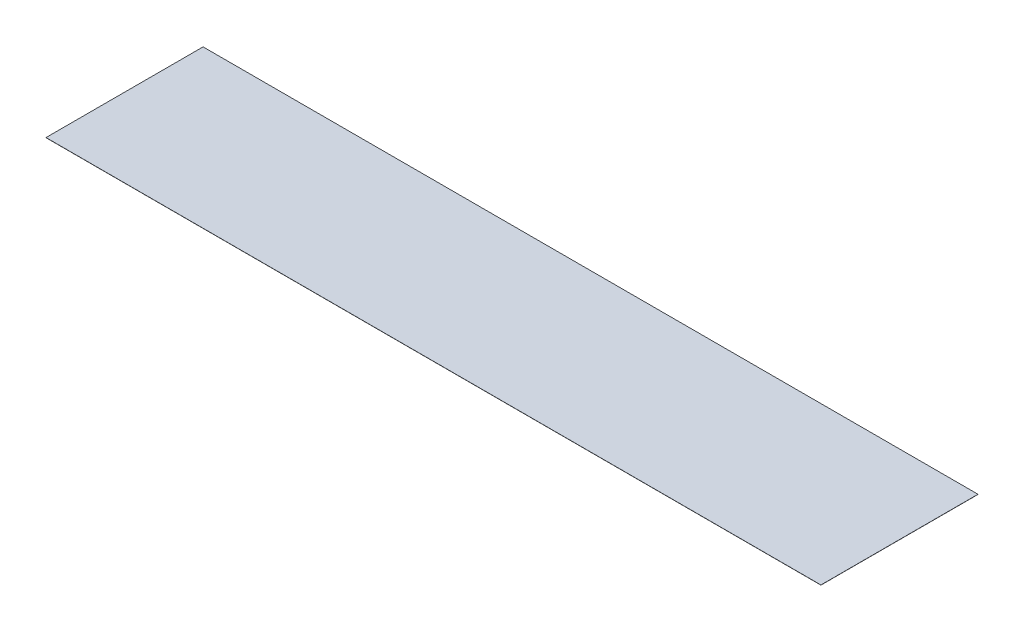
ISO-10303-21;
HEADER;
FILE_DESCRIPTION(('STEP AP214'),'2;1');
FILE_NAME('part.step','',(''),(''),'','','');
FILE_SCHEMA(('AUTOMOTIVE_DESIGN { 1 0 10303 214 1 1 1 1 }'));
ENDSEC;
DATA;
#1=APPLICATION_CONTEXT('core data for automotive mechanical design processes');
#2=APPLICATION_PROTOCOL_DEFINITION('international standard','automotive_design',2000,#1);
#3=PRODUCT_CONTEXT('',#1,'mechanical');
#4=PRODUCT('Part','Part','',(#3));
#5=PRODUCT_RELATED_PRODUCT_CATEGORY('part','',(#4));
#6=PRODUCT_DEFINITION_FORMATION('','',#4);
#7=PRODUCT_DEFINITION_CONTEXT('part definition',#1,'design');
#8=PRODUCT_DEFINITION('design','',#6,#7);
#9=PRODUCT_DEFINITION_SHAPE('','',#8);
#10=(LENGTH_UNIT() NAMED_UNIT(*) SI_UNIT(.MILLI.,.METRE.));
#11=(NAMED_UNIT(*) PLANE_ANGLE_UNIT() SI_UNIT($,.RADIAN.));
#12=(NAMED_UNIT(*) SI_UNIT($,.STERADIAN.) SOLID_ANGLE_UNIT());
#13=UNCERTAINTY_MEASURE_WITH_UNIT(LENGTH_MEASURE(1.E-05),#10,'distance_accuracy_value','');
#14=(GEOMETRIC_REPRESENTATION_CONTEXT(3) GLOBAL_UNCERTAINTY_ASSIGNED_CONTEXT((#13)) GLOBAL_UNIT_ASSIGNED_CONTEXT((#10,
#11,#12)) REPRESENTATION_CONTEXT('',''));
#15=CARTESIAN_POINT('',(0.,0.,0.));
#16=DIRECTION('',(0.,0.,1.));
#17=DIRECTION('',(1.,0.,0.));
#18=AXIS2_PLACEMENT_3D('',#15,#16,#17);
#19=CARTESIAN_POINT('',(-11277.6,4.7752,0.));
#20=DIRECTION('',(1.,0.,0.));
#21=DIRECTION('',(0.,0.,-1.));
#22=AXIS2_PLACEMENT_3D('',#19,#20,#21);
#23=PLANE('',#22);
#24=DIRECTION('',(0.,0.,1.));
#25=VECTOR('',#24,1.);
#26=CARTESIAN_POINT('',(-11277.6,0.,0.));
#27=LINE('',#26,#25);
#28=CARTESIAN_POINT('',(-11277.6,0.,-4572.));
#29=VERTEX_POINT('',#28);
#30=CARTESIAN_POINT('',(-11277.6,0.,0.));
#31=VERTEX_POINT('',#30);
#32=EDGE_CURVE('E97',#29,#31,#27,.T.);
#33=ORIENTED_EDGE('',*,*,#32,.T.);
#34=DIRECTION('',(0.,-1.,0.));
#35=VECTOR('',#34,1.);
#36=CARTESIAN_POINT('',(-11277.6,4.7752,0.));
#37=LINE('',#36,#35);
#38=CARTESIAN_POINT('',(-11277.6,4.7752,0.));
#39=VERTEX_POINT('',#38);
#40=EDGE_CURVE('E11',#39,#31,#37,.T.);
#41=ORIENTED_EDGE('',*,*,#40,.F.);
#42=DIRECTION('',(0.,0.,1.));
#43=VECTOR('',#42,1.);
#44=CARTESIAN_POINT('',(-11277.6,4.7752,0.));
#45=LINE('',#44,#43);
#46=CARTESIAN_POINT('',(-11277.6,4.7752,-4572.));
#47=VERTEX_POINT('',#46);
#48=EDGE_CURVE('E85',#47,#39,#45,.T.);
#49=ORIENTED_EDGE('',*,*,#48,.F.);
#50=DIRECTION('',(0.,-1.,0.));
#51=VECTOR('',#50,1.);
#52=CARTESIAN_POINT('',(-11277.6,4.7752,-4572.));
#53=LINE('',#52,#51);
#54=EDGE_CURVE('E93',#47,#29,#53,.T.);
#55=ORIENTED_EDGE('',*,*,#54,.T.);
#56=EDGE_LOOP('',(#33,#41,#49,#55));
#57=FACE_BOUND('',#56,.T.);
#58=ADVANCED_FACE('F34',(#57),#23,.F.);
#59=CARTESIAN_POINT('',(-11277.6,4.7752,0.));
#60=DIRECTION('',(0.,0.,-1.));
#61=DIRECTION('',(-1.,0.,0.));
#62=AXIS2_PLACEMENT_3D('',#59,#60,#61);
#63=PLANE('',#62);
#64=DIRECTION('',(1.,0.,0.));
#65=VECTOR('',#64,1.);
#66=CARTESIAN_POINT('',(-11277.6,0.,0.));
#67=LINE('',#66,#65);
#68=CARTESIAN_POINT('',(11277.6,0.,-4.21884749357559E-12));
#69=VERTEX_POINT('',#68);
#70=EDGE_CURVE('E89',#31,#69,#67,.T.);
#71=ORIENTED_EDGE('',*,*,#70,.T.);
#72=DIRECTION('',(0.,-1.,0.));
#73=VECTOR('',#72,1.);
#74=CARTESIAN_POINT('',(11277.6,4.7752,-4.21884749357559E-12));
#75=LINE('',#74,#73);
#76=CARTESIAN_POINT('',(11277.6,4.7752,-4.21884749357559E-12));
#77=VERTEX_POINT('',#76);
#78=EDGE_CURVE('E42',#77,#69,#75,.T.);
#79=ORIENTED_EDGE('',*,*,#78,.F.);
#80=DIRECTION('',(1.,0.,0.));
#81=VECTOR('',#80,1.);
#82=CARTESIAN_POINT('',(-11277.6,4.7752,0.));
#83=LINE('',#82,#81);
#84=EDGE_CURVE('E80',#39,#77,#83,.T.);
#85=ORIENTED_EDGE('',*,*,#84,.F.);
#86=ORIENTED_EDGE('',*,*,#40,.T.);
#87=EDGE_LOOP('',(#71,#79,#85,#86));
#88=FACE_BOUND('',#87,.T.);
#89=ADVANCED_FACE('F88',(#88),#63,.F.);
#90=CARTESIAN_POINT('',(11277.6,4.7752,-4.21884749357559E-12));
#91=DIRECTION('',(-1.,0.,0.));
#92=DIRECTION('',(0.,0.,1.));
#93=AXIS2_PLACEMENT_3D('',#90,#91,#92);
#94=PLANE('',#93);
#95=DIRECTION('',(0.,0.,-1.));
#96=VECTOR('',#95,1.);
#97=CARTESIAN_POINT('',(11277.6,0.,-4.21884749357559E-12));
#98=LINE('',#97,#96);
#99=CARTESIAN_POINT('',(11277.6,0.,-4572.));
#100=VERTEX_POINT('',#99);
#101=EDGE_CURVE('E67',#69,#100,#98,.T.);
#102=ORIENTED_EDGE('',*,*,#101,.T.);
#103=DIRECTION('',(0.,-1.,0.));
#104=VECTOR('',#103,1.);
#105=CARTESIAN_POINT('',(11277.6,4.7752,-4572.));
#106=LINE('',#105,#104);
#107=CARTESIAN_POINT('',(11277.6,4.7752,-4572.));
#108=VERTEX_POINT('',#107);
#109=EDGE_CURVE('E90',#108,#100,#106,.T.);
#110=ORIENTED_EDGE('',*,*,#109,.F.);
#111=DIRECTION('',(0.,0.,-1.));
#112=VECTOR('',#111,1.);
#113=CARTESIAN_POINT('',(11277.6,4.7752,-4.21884749357559E-12));
#114=LINE('',#113,#112);
#115=EDGE_CURVE('E83',#77,#108,#114,.T.);
#116=ORIENTED_EDGE('',*,*,#115,.F.);
#117=ORIENTED_EDGE('',*,*,#78,.T.);
#118=EDGE_LOOP('',(#102,#110,#116,#117));
#119=FACE_BOUND('',#118,.T.);
#120=ADVANCED_FACE('F91',(#119),#94,.F.);
#121=CARTESIAN_POINT('',(-11277.6,4.7752,-4572.));
#122=DIRECTION('',(0.,0.,1.));
#123=DIRECTION('',(1.,0.,0.));
#124=AXIS2_PLACEMENT_3D('',#121,#122,#123);
#125=PLANE('',#124);
#126=DIRECTION('',(-1.,0.,0.));
#127=VECTOR('',#126,1.);
#128=CARTESIAN_POINT('',(-11277.6,0.,-4572.));
#129=LINE('',#128,#127);
#130=EDGE_CURVE('E73',#100,#29,#129,.T.);
#131=ORIENTED_EDGE('',*,*,#130,.T.);
#132=ORIENTED_EDGE('',*,*,#54,.F.);
#133=DIRECTION('',(-1.,0.,0.));
#134=VECTOR('',#133,1.);
#135=CARTESIAN_POINT('',(-11277.6,4.7752,-4572.));
#136=LINE('',#135,#134);
#137=EDGE_CURVE('E50',#108,#47,#136,.T.);
#138=ORIENTED_EDGE('',*,*,#137,.F.);
#139=ORIENTED_EDGE('',*,*,#109,.T.);
#140=EDGE_LOOP('',(#131,#132,#138,#139));
#141=FACE_BOUND('',#140,.T.);
#142=ADVANCED_FACE('F104',(#141),#125,.F.);
#143=CARTESIAN_POINT('',(0.,4.7752,0.));
#144=DIRECTION('',(0.,-1.,0.));
#145=DIRECTION('',(0.,0.,-1.));
#146=AXIS2_PLACEMENT_3D('',#143,#144,#145);
#147=PLANE('',#146);
#148=ORIENTED_EDGE('',*,*,#48,.T.);
#149=ORIENTED_EDGE('',*,*,#84,.T.);
#150=ORIENTED_EDGE('',*,*,#115,.T.);
#151=ORIENTED_EDGE('',*,*,#137,.T.);
#152=EDGE_LOOP('',(#148,#149,#150,#151));
#153=FACE_BOUND('',#152,.T.);
#154=ADVANCED_FACE('F81',(#153),#147,.F.);
#155=CARTESIAN_POINT('',(0.,0.,0.));
#156=DIRECTION('',(0.,-1.,0.));
#157=DIRECTION('',(0.,0.,-1.));
#158=AXIS2_PLACEMENT_3D('',#155,#156,#157);
#159=PLANE('',#158);
#160=ORIENTED_EDGE('',*,*,#32,.F.);
#161=ORIENTED_EDGE('',*,*,#130,.F.);
#162=ORIENTED_EDGE('',*,*,#101,.F.);
#163=ORIENTED_EDGE('',*,*,#70,.F.);
#164=EDGE_LOOP('',(#160,#161,#162,#163));
#165=FACE_BOUND('',#164,.T.);
#166=ADVANCED_FACE('F107',(#165),#159,.T.);
#167=CLOSED_SHELL('',(#58,#89,#120,#142,#154,#166));
#168=MANIFOLD_SOLID_BREP('B2',#167);
#169=ADVANCED_BREP_SHAPE_REPRESENTATION('',(#18,#168),#14);
#170=SHAPE_DEFINITION_REPRESENTATION(#9,#169);
ENDSEC;
END-ISO-10303-21;
